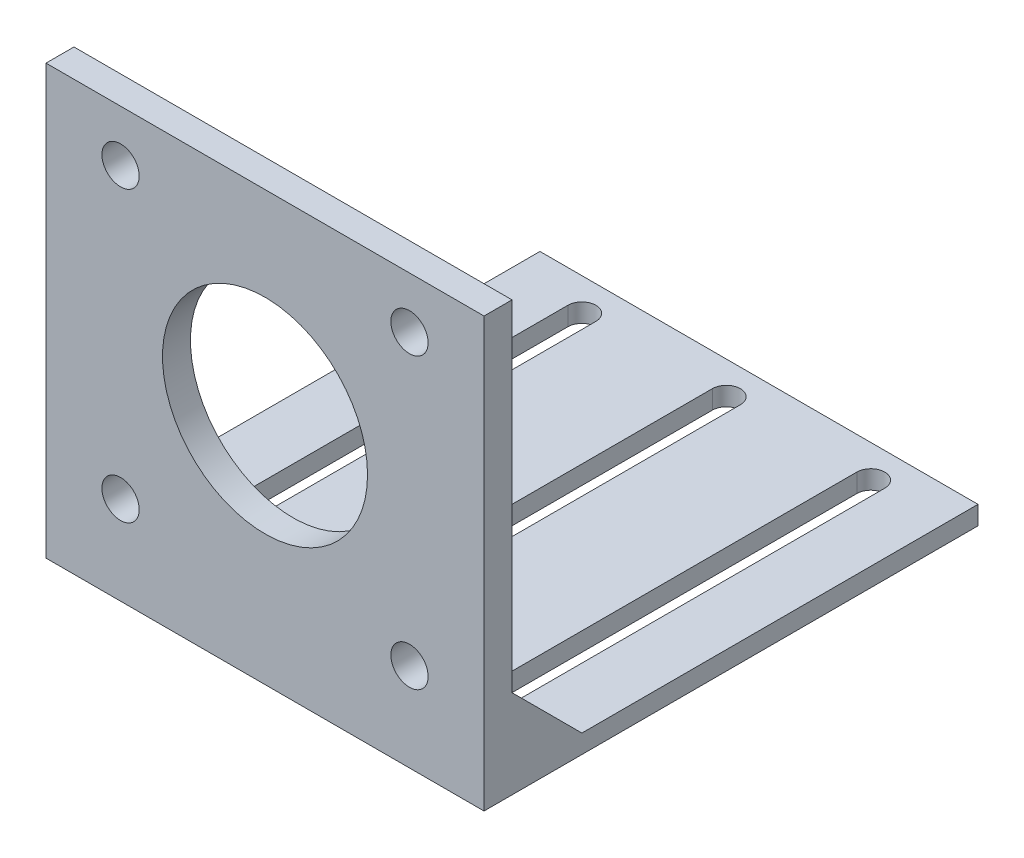
ISO-10303-21;
HEADER;
FILE_DESCRIPTION(('STEP AP214'),'2;1');
FILE_NAME('part.step','',(''),(''),'','','');
FILE_SCHEMA(('AUTOMOTIVE_DESIGN { 1 0 10303 214 1 1 1 1 }'));
ENDSEC;
DATA;
#1=APPLICATION_CONTEXT('core data for automotive mechanical design processes');
#2=APPLICATION_PROTOCOL_DEFINITION('international standard','automotive_design',2000,#1);
#3=PRODUCT_CONTEXT('',#1,'mechanical');
#4=PRODUCT('Part','Part','',(#3));
#5=PRODUCT_RELATED_PRODUCT_CATEGORY('part','',(#4));
#6=PRODUCT_DEFINITION_FORMATION('','',#4);
#7=PRODUCT_DEFINITION_CONTEXT('part definition',#1,'design');
#8=PRODUCT_DEFINITION('design','',#6,#7);
#9=PRODUCT_DEFINITION_SHAPE('','',#8);
#10=(LENGTH_UNIT() NAMED_UNIT(*) SI_UNIT(.MILLI.,.METRE.));
#11=(NAMED_UNIT(*) PLANE_ANGLE_UNIT() SI_UNIT($,.RADIAN.));
#12=(NAMED_UNIT(*) SI_UNIT($,.STERADIAN.) SOLID_ANGLE_UNIT());
#13=UNCERTAINTY_MEASURE_WITH_UNIT(LENGTH_MEASURE(1.E-05),#10,'distance_accuracy_value','');
#14=(GEOMETRIC_REPRESENTATION_CONTEXT(3) GLOBAL_UNCERTAINTY_ASSIGNED_CONTEXT((#13)) GLOBAL_UNIT_ASSIGNED_CONTEXT((#10,
#11,#12)) REPRESENTATION_CONTEXT('',''));
#15=CARTESIAN_POINT('',(0.,0.,0.));
#16=DIRECTION('',(0.,0.,1.));
#17=DIRECTION('',(1.,0.,0.));
#18=AXIS2_PLACEMENT_3D('',#15,#16,#17);
#19=CARTESIAN_POINT('',(0.,0.,-3.));
#20=DIRECTION('',(0.,0.,1.));
#21=DIRECTION('',(1.,0.,0.));
#22=AXIS2_PLACEMENT_3D('',#19,#20,#21);
#23=PLANE('',#22);
#24=CARTESIAN_POINT('',(8.,36.5,-3.));
#25=DIRECTION('',(0.,0.,1.));
#26=DIRECTION('',(1.,0.,0.));
#27=AXIS2_PLACEMENT_3D('',#24,#25,#26);
#28=CIRCLE('',#27,2.);
#29=CARTESIAN_POINT('',(10.,36.5,-3.));
#30=VERTEX_POINT('',#29);
#31=EDGE_CURVE('E348',#30,#30,#28,.F.);
#32=ORIENTED_EDGE('',*,*,#31,.F.);
#33=EDGE_LOOP('',(#32));
#34=FACE_BOUND('',#33,.T.);
#35=CARTESIAN_POINT('',(39.,36.5,-3.));
#36=DIRECTION('',(0.,0.,1.));
#37=DIRECTION('',(1.,0.,0.));
#38=AXIS2_PLACEMENT_3D('',#35,#36,#37);
#39=CIRCLE('',#38,2.00000000000001);
#40=CARTESIAN_POINT('',(41.,36.5,-3.));
#41=VERTEX_POINT('',#40);
#42=EDGE_CURVE('E345',#41,#41,#39,.T.);
#43=ORIENTED_EDGE('',*,*,#42,.T.);
#44=EDGE_LOOP('',(#43));
#45=FACE_BOUND('',#44,.T.);
#46=CARTESIAN_POINT('',(23.5,21.,-3.));
#47=DIRECTION('',(0.,0.,1.));
#48=DIRECTION('',(1.,0.,0.));
#49=AXIS2_PLACEMENT_3D('',#46,#47,#48);
#50=CIRCLE('',#49,11.);
#51=CARTESIAN_POINT('',(34.5,21.,-3.));
#52=VERTEX_POINT('',#51);
#53=EDGE_CURVE('E336',#52,#52,#50,.T.);
#54=ORIENTED_EDGE('',*,*,#53,.T.);
#55=EDGE_LOOP('',(#54));
#56=FACE_BOUND('',#55,.T.);
#57=CARTESIAN_POINT('',(8.,5.49999999999999,-3.));
#58=DIRECTION('',(0.,0.,1.));
#59=DIRECTION('',(1.,0.,0.));
#60=AXIS2_PLACEMENT_3D('',#57,#58,#59);
#61=CIRCLE('',#60,2.);
#62=CARTESIAN_POINT('',(10.,5.49999999999999,-3.));
#63=VERTEX_POINT('',#62);
#64=EDGE_CURVE('E332',#63,#63,#61,.T.);
#65=ORIENTED_EDGE('',*,*,#64,.T.);
#66=EDGE_LOOP('',(#65));
#67=FACE_BOUND('',#66,.T.);
#68=CARTESIAN_POINT('',(39.,5.49999999999999,-3.));
#69=DIRECTION('',(0.,0.,1.));
#70=DIRECTION('',(1.,0.,0.));
#71=AXIS2_PLACEMENT_3D('',#68,#69,#70);
#72=CIRCLE('',#71,2.);
#73=CARTESIAN_POINT('',(41.,5.49999999999999,-3.));
#74=VERTEX_POINT('',#73);
#75=EDGE_CURVE('E329',#74,#74,#72,.F.);
#76=ORIENTED_EDGE('',*,*,#75,.F.);
#77=EDGE_LOOP('',(#76));
#78=FACE_BOUND('',#77,.T.);
#79=DIRECTION('',(0.,-1.,0.));
#80=VECTOR('',#79,1.);
#81=CARTESIAN_POINT('',(47.,0.,-3.));
#82=LINE('',#81,#80);
#83=CARTESIAN_POINT('',(47.,42.,-3.));
#84=VERTEX_POINT('',#83);
#85=CARTESIAN_POINT('',(47.,5.5,-3.));
#86=VERTEX_POINT('',#85);
#87=EDGE_CURVE('E339',#84,#86,#82,.T.);
#88=ORIENTED_EDGE('',*,*,#87,.T.);
#89=DIRECTION('',(1.,0.,0.));
#90=VECTOR('',#89,1.);
#91=CARTESIAN_POINT('',(0.,5.5,-3.));
#92=LINE('',#91,#90);
#93=CARTESIAN_POINT('',(45.,5.5,-3.));
#94=VERTEX_POINT('',#93);
#95=EDGE_CURVE('E291',#86,#94,#92,.F.);
#96=ORIENTED_EDGE('',*,*,#95,.T.);
#97=DIRECTION('',(0.,1.,0.));
#98=VECTOR('',#97,1.);
#99=CARTESIAN_POINT('',(45.,0.,-3.));
#100=LINE('',#99,#98);
#101=CARTESIAN_POINT('',(45.,-2.,-3.));
#102=VERTEX_POINT('',#101);
#103=EDGE_CURVE('E286',#102,#94,#100,.T.);
#104=ORIENTED_EDGE('',*,*,#103,.F.);
#105=DIRECTION('',(1.,0.,0.));
#106=VECTOR('',#105,1.);
#107=CARTESIAN_POINT('',(47.,-2.,-3.));
#108=LINE('',#107,#106);
#109=CARTESIAN_POINT('',(2.,-2.,-3.));
#110=VERTEX_POINT('',#109);
#111=EDGE_CURVE('E303',#110,#102,#108,.T.);
#112=ORIENTED_EDGE('',*,*,#111,.F.);
#113=DIRECTION('',(0.,1.,0.));
#114=VECTOR('',#113,1.);
#115=CARTESIAN_POINT('',(2.,0.,-3.));
#116=LINE('',#115,#114);
#117=CARTESIAN_POINT('',(2.,5.5,-3.));
#118=VERTEX_POINT('',#117);
#119=EDGE_CURVE('E297',#110,#118,#116,.T.);
#120=ORIENTED_EDGE('',*,*,#119,.T.);
#121=DIRECTION('',(1.,0.,0.));
#122=VECTOR('',#121,1.);
#123=CARTESIAN_POINT('',(0.,5.5,-3.));
#124=LINE('',#123,#122);
#125=CARTESIAN_POINT('',(0.,5.5,-3.));
#126=VERTEX_POINT('',#125);
#127=EDGE_CURVE('E301',#118,#126,#124,.F.);
#128=ORIENTED_EDGE('',*,*,#127,.T.);
#129=DIRECTION('',(0.,1.,0.));
#130=VECTOR('',#129,1.);
#131=CARTESIAN_POINT('',(0.,0.,-3.));
#132=LINE('',#131,#130);
#133=CARTESIAN_POINT('',(0.,42.,-3.));
#134=VERTEX_POINT('',#133);
#135=EDGE_CURVE('E343',#126,#134,#132,.T.);
#136=ORIENTED_EDGE('',*,*,#135,.T.);
#137=DIRECTION('',(1.,0.,0.));
#138=VECTOR('',#137,1.);
#139=CARTESIAN_POINT('',(0.,42.,-3.));
#140=LINE('',#139,#138);
#141=EDGE_CURVE('E341',#134,#84,#140,.T.);
#142=ORIENTED_EDGE('',*,*,#141,.T.);
#143=EDGE_LOOP('',(#88,#96,#104,#112,#120,#128,#136,#142));
#144=FACE_BOUND('',#143,.T.);
#145=ADVANCED_FACE('F35',(#34,#45,#56,#67,#78,#144),#23,.F.);
#146=CARTESIAN_POINT('',(0.,0.,-3.));
#147=DIRECTION('',(1.,0.,0.));
#148=DIRECTION('',(0.,0.,-1.));
#149=AXIS2_PLACEMENT_3D('',#146,#147,#148);
#150=PLANE('',#149);
#151=ORIENTED_EDGE('',*,*,#135,.F.);
#152=DIRECTION('',(0.,-0.707106781186548,-0.707106781186547));
#153=VECTOR('',#152,1.);
#154=CARTESIAN_POINT('',(0.,5.5,-3.));
#155=LINE('',#154,#153);
#156=CARTESIAN_POINT('',(0.,-2.,-10.5));
#157=VERTEX_POINT('',#156);
#158=EDGE_CURVE('E293',#126,#157,#155,.T.);
#159=ORIENTED_EDGE('',*,*,#158,.T.);
#160=DIRECTION('',(0.,0.,1.));
#161=VECTOR('',#160,1.);
#162=CARTESIAN_POINT('',(0.,-2.,-53.));
#163=LINE('',#162,#161);
#164=CARTESIAN_POINT('',(0.,-2.,-53.));
#165=VERTEX_POINT('',#164);
#166=EDGE_CURVE('E318',#165,#157,#163,.T.);
#167=ORIENTED_EDGE('',*,*,#166,.F.);
#168=DIRECTION('',(0.,1.,0.));
#169=VECTOR('',#168,1.);
#170=CARTESIAN_POINT('',(0.,-2.,-53.));
#171=LINE('',#170,#169);
#172=CARTESIAN_POINT('',(0.,-4.,-53.));
#173=VERTEX_POINT('',#172);
#174=EDGE_CURVE('E307',#173,#165,#171,.T.);
#175=ORIENTED_EDGE('',*,*,#174,.F.);
#176=DIRECTION('',(0.,0.,1.));
#177=VECTOR('',#176,1.);
#178=CARTESIAN_POINT('',(0.,-4.,-3.));
#179=LINE('',#178,#177);
#180=CARTESIAN_POINT('',(0.,-4.,0.));
#181=VERTEX_POINT('',#180);
#182=EDGE_CURVE('E322',#173,#181,#179,.T.);
#183=ORIENTED_EDGE('',*,*,#182,.T.);
#184=DIRECTION('',(0.,1.,0.));
#185=VECTOR('',#184,1.);
#186=CARTESIAN_POINT('',(0.,0.,0.));
#187=LINE('',#186,#185);
#188=CARTESIAN_POINT('',(0.,42.,0.));
#189=VERTEX_POINT('',#188);
#190=EDGE_CURVE('E364',#181,#189,#187,.T.);
#191=ORIENTED_EDGE('',*,*,#190,.T.);
#192=DIRECTION('',(0.,0.,1.));
#193=VECTOR('',#192,1.);
#194=CARTESIAN_POINT('',(0.,42.,-3.));
#195=LINE('',#194,#193);
#196=EDGE_CURVE('E371',#134,#189,#195,.T.);
#197=ORIENTED_EDGE('',*,*,#196,.F.);
#198=EDGE_LOOP('',(#151,#159,#167,#175,#183,#191,#197));
#199=FACE_BOUND('',#198,.T.);
#200=ADVANCED_FACE('F405',(#199),#150,.F.);
#201=CARTESIAN_POINT('',(0.,42.,-3.));
#202=DIRECTION('',(0.,-1.,0.));
#203=DIRECTION('',(0.,0.,-1.));
#204=AXIS2_PLACEMENT_3D('',#201,#202,#203);
#205=PLANE('',#204);
#206=DIRECTION('',(1.,0.,0.));
#207=VECTOR('',#206,1.);
#208=CARTESIAN_POINT('',(0.,42.,0.));
#209=LINE('',#208,#207);
#210=CARTESIAN_POINT('',(47.,42.,0.));
#211=VERTEX_POINT('',#210);
#212=EDGE_CURVE('E362',#189,#211,#209,.T.);
#213=ORIENTED_EDGE('',*,*,#212,.T.);
#214=DIRECTION('',(0.,0.,1.));
#215=VECTOR('',#214,1.);
#216=CARTESIAN_POINT('',(47.,42.,-3.));
#217=LINE('',#216,#215);
#218=EDGE_CURVE('E351',#84,#211,#217,.T.);
#219=ORIENTED_EDGE('',*,*,#218,.F.);
#220=ORIENTED_EDGE('',*,*,#141,.F.);
#221=ORIENTED_EDGE('',*,*,#196,.T.);
#222=EDGE_LOOP('',(#213,#219,#220,#221));
#223=FACE_BOUND('',#222,.T.);
#224=ADVANCED_FACE('F420',(#223),#205,.F.);
#225=CARTESIAN_POINT('',(39.,36.5,-3.));
#226=DIRECTION('',(0.,0.,1.));
#227=DIRECTION('',(1.,0.,0.));
#228=AXIS2_PLACEMENT_3D('',#225,#226,#227);
#229=CYLINDRICAL_SURFACE('',#228,2.00000000000001);
#230=ORIENTED_EDGE('',*,*,#42,.F.);
#231=EDGE_LOOP('',(#230));
#232=FACE_BOUND('',#231,.T.);
#233=CARTESIAN_POINT('',(39.,36.5,0.));
#234=DIRECTION('',(0.,0.,1.));
#235=DIRECTION('',(1.,0.,0.));
#236=AXIS2_PLACEMENT_3D('',#233,#234,#235);
#237=CIRCLE('',#236,2.00000000000001);
#238=CARTESIAN_POINT('',(41.,36.5,0.));
#239=VERTEX_POINT('',#238);
#240=EDGE_CURVE('E366',#239,#239,#237,.T.);
#241=ORIENTED_EDGE('',*,*,#240,.T.);
#242=EDGE_LOOP('',(#241));
#243=FACE_BOUND('',#242,.T.);
#244=ADVANCED_FACE('F454',(#232,#243),#229,.F.);
#245=CARTESIAN_POINT('',(47.,0.,-3.));
#246=DIRECTION('',(-1.,0.,0.));
#247=DIRECTION('',(0.,0.,1.));
#248=AXIS2_PLACEMENT_3D('',#245,#246,#247);
#249=PLANE('',#248);
#250=DIRECTION('',(0.,0.,1.));
#251=VECTOR('',#250,1.);
#252=CARTESIAN_POINT('',(47.,-2.,-53.));
#253=LINE('',#252,#251);
#254=CARTESIAN_POINT('',(47.,-2.,-53.));
#255=VERTEX_POINT('',#254);
#256=CARTESIAN_POINT('',(47.,-2.,-10.5));
#257=VERTEX_POINT('',#256);
#258=EDGE_CURVE('E314',#255,#257,#253,.T.);
#259=ORIENTED_EDGE('',*,*,#258,.T.);
#260=DIRECTION('',(0.,-0.707106781186547,-0.707106781186548));
#261=VECTOR('',#260,1.);
#262=CARTESIAN_POINT('',(47.,5.5,-3.));
#263=LINE('',#262,#261);
#264=EDGE_CURVE('E283',#86,#257,#263,.T.);
#265=ORIENTED_EDGE('',*,*,#264,.F.);
#266=ORIENTED_EDGE('',*,*,#87,.F.);
#267=ORIENTED_EDGE('',*,*,#218,.T.);
#268=DIRECTION('',(0.,-1.,0.));
#269=VECTOR('',#268,1.);
#270=CARTESIAN_POINT('',(47.,0.,0.));
#271=LINE('',#270,#269);
#272=CARTESIAN_POINT('',(47.,-4.,0.));
#273=VERTEX_POINT('',#272);
#274=EDGE_CURVE('E360',#211,#273,#271,.T.);
#275=ORIENTED_EDGE('',*,*,#274,.T.);
#276=DIRECTION('',(0.,0.,1.));
#277=VECTOR('',#276,1.);
#278=CARTESIAN_POINT('',(47.,-4.,-3.));
#279=LINE('',#278,#277);
#280=CARTESIAN_POINT('',(47.,-4.,-53.));
#281=VERTEX_POINT('',#280);
#282=EDGE_CURVE('E323',#281,#273,#279,.T.);
#283=ORIENTED_EDGE('',*,*,#282,.F.);
#284=DIRECTION('',(0.,-1.,0.));
#285=VECTOR('',#284,1.);
#286=CARTESIAN_POINT('',(47.,-4.,-53.));
#287=LINE('',#286,#285);
#288=EDGE_CURVE('E311',#255,#281,#287,.T.);
#289=ORIENTED_EDGE('',*,*,#288,.F.);
#290=EDGE_LOOP('',(#259,#265,#266,#267,#275,#283,#289));
#291=FACE_BOUND('',#290,.T.);
#292=ADVANCED_FACE('F394',(#291),#249,.F.);
#293=CARTESIAN_POINT('',(23.5,21.,-3.));
#294=DIRECTION('',(0.,0.,1.));
#295=DIRECTION('',(1.,0.,0.));
#296=AXIS2_PLACEMENT_3D('',#293,#294,#295);
#297=CYLINDRICAL_SURFACE('',#296,11.);
#298=ORIENTED_EDGE('',*,*,#53,.F.);
#299=EDGE_LOOP('',(#298));
#300=FACE_BOUND('',#299,.T.);
#301=CARTESIAN_POINT('',(23.5,21.,0.));
#302=DIRECTION('',(0.,0.,1.));
#303=DIRECTION('',(1.,0.,0.));
#304=AXIS2_PLACEMENT_3D('',#301,#302,#303);
#305=CIRCLE('',#304,11.);
#306=CARTESIAN_POINT('',(34.5,21.,0.));
#307=VERTEX_POINT('',#306);
#308=EDGE_CURVE('E357',#307,#307,#305,.T.);
#309=ORIENTED_EDGE('',*,*,#308,.T.);
#310=EDGE_LOOP('',(#309));
#311=FACE_BOUND('',#310,.T.);
#312=ADVANCED_FACE('F462',(#300,#311),#297,.F.);
#313=CARTESIAN_POINT('',(8.,5.49999999999999,-3.));
#314=DIRECTION('',(0.,0.,1.));
#315=DIRECTION('',(1.,0.,0.));
#316=AXIS2_PLACEMENT_3D('',#313,#314,#315);
#317=CYLINDRICAL_SURFACE('',#316,2.);
#318=ORIENTED_EDGE('',*,*,#64,.F.);
#319=EDGE_LOOP('',(#318));
#320=FACE_BOUND('',#319,.T.);
#321=CARTESIAN_POINT('',(8.,5.49999999999999,0.));
#322=DIRECTION('',(0.,0.,1.));
#323=DIRECTION('',(1.,0.,0.));
#324=AXIS2_PLACEMENT_3D('',#321,#322,#323);
#325=CIRCLE('',#324,2.);
#326=CARTESIAN_POINT('',(10.,5.49999999999999,0.));
#327=VERTEX_POINT('',#326);
#328=EDGE_CURVE('E354',#327,#327,#325,.T.);
#329=ORIENTED_EDGE('',*,*,#328,.T.);
#330=EDGE_LOOP('',(#329));
#331=FACE_BOUND('',#330,.T.);
#332=ADVANCED_FACE('F464',(#320,#331),#317,.F.);
#333=CARTESIAN_POINT('',(39.,5.49999999999999,-3.));
#334=DIRECTION('',(0.,0.,1.));
#335=DIRECTION('',(1.,0.,0.));
#336=AXIS2_PLACEMENT_3D('',#333,#334,#335);
#337=CYLINDRICAL_SURFACE('',#336,2.);
#338=ORIENTED_EDGE('',*,*,#75,.T.);
#339=EDGE_LOOP('',(#338));
#340=FACE_BOUND('',#339,.T.);
#341=CARTESIAN_POINT('',(39.,5.49999999999999,0.));
#342=DIRECTION('',(0.,0.,1.));
#343=DIRECTION('',(1.,0.,0.));
#344=AXIS2_PLACEMENT_3D('',#341,#342,#343);
#345=CIRCLE('',#344,2.);
#346=CARTESIAN_POINT('',(41.,5.49999999999999,0.));
#347=VERTEX_POINT('',#346);
#348=EDGE_CURVE('E326',#347,#347,#345,.F.);
#349=ORIENTED_EDGE('',*,*,#348,.F.);
#350=EDGE_LOOP('',(#349));
#351=FACE_BOUND('',#350,.T.);
#352=ADVANCED_FACE('F37',(#340,#351),#337,.F.);
#353=CARTESIAN_POINT('',(8.,36.5,-3.));
#354=DIRECTION('',(0.,0.,1.));
#355=DIRECTION('',(1.,0.,0.));
#356=AXIS2_PLACEMENT_3D('',#353,#354,#355);
#357=CYLINDRICAL_SURFACE('',#356,2.);
#358=ORIENTED_EDGE('',*,*,#31,.T.);
#359=EDGE_LOOP('',(#358));
#360=FACE_BOUND('',#359,.T.);
#361=CARTESIAN_POINT('',(8.,36.5,0.));
#362=DIRECTION('',(0.,0.,1.));
#363=DIRECTION('',(1.,0.,0.));
#364=AXIS2_PLACEMENT_3D('',#361,#362,#363);
#365=CIRCLE('',#364,2.);
#366=CARTESIAN_POINT('',(10.,36.5,0.));
#367=VERTEX_POINT('',#366);
#368=EDGE_CURVE('E333',#367,#367,#365,.F.);
#369=ORIENTED_EDGE('',*,*,#368,.F.);
#370=EDGE_LOOP('',(#369));
#371=FACE_BOUND('',#370,.T.);
#372=ADVANCED_FACE('F438',(#360,#371),#357,.F.);
#373=CARTESIAN_POINT('',(0.,0.,0.));
#374=DIRECTION('',(0.,0.,1.));
#375=DIRECTION('',(1.,0.,0.));
#376=AXIS2_PLACEMENT_3D('',#373,#374,#375);
#377=PLANE('',#376);
#378=DIRECTION('',(-1.,0.,0.));
#379=VECTOR('',#378,1.);
#380=CARTESIAN_POINT('',(0.,-4.,0.));
#381=LINE('',#380,#379);
#382=EDGE_CURVE('E320',#273,#181,#381,.T.);
#383=ORIENTED_EDGE('',*,*,#382,.F.);
#384=ORIENTED_EDGE('',*,*,#274,.F.);
#385=ORIENTED_EDGE('',*,*,#212,.F.);
#386=ORIENTED_EDGE('',*,*,#190,.F.);
#387=EDGE_LOOP('',(#383,#384,#385,#386));
#388=FACE_BOUND('',#387,.T.);
#389=ORIENTED_EDGE('',*,*,#348,.T.);
#390=EDGE_LOOP('',(#389));
#391=FACE_BOUND('',#390,.T.);
#392=ORIENTED_EDGE('',*,*,#328,.F.);
#393=EDGE_LOOP('',(#392));
#394=FACE_BOUND('',#393,.T.);
#395=ORIENTED_EDGE('',*,*,#308,.F.);
#396=EDGE_LOOP('',(#395));
#397=FACE_BOUND('',#396,.T.);
#398=ORIENTED_EDGE('',*,*,#240,.F.);
#399=EDGE_LOOP('',(#398));
#400=FACE_BOUND('',#399,.T.);
#401=ORIENTED_EDGE('',*,*,#368,.T.);
#402=EDGE_LOOP('',(#401));
#403=FACE_BOUND('',#402,.T.);
#404=ADVANCED_FACE('F425',(#388,#391,#394,#397,#400,#403),#377,.T.);
#405=CARTESIAN_POINT('',(0.,-4.,-3.));
#406=DIRECTION('',(0.,1.,0.));
#407=DIRECTION('',(0.,0.,1.));
#408=AXIS2_PLACEMENT_3D('',#405,#406,#407);
#409=PLANE('',#408);
#410=DIRECTION('',(0.,0.,1.));
#411=VECTOR('',#410,1.);
#412=CARTESIAN_POINT('',(9.50000000000001,-4.,-3.));
#413=LINE('',#412,#411);
#414=CARTESIAN_POINT('',(9.5,-4.,-49.5));
#415=VERTEX_POINT('',#414);
#416=CARTESIAN_POINT('',(9.50000000000001,-4.,-10.5));
#417=VERTEX_POINT('',#416);
#418=EDGE_CURVE('E248',#415,#417,#413,.T.);
#419=ORIENTED_EDGE('',*,*,#418,.F.);
#420=CARTESIAN_POINT('',(8.,-4.,-49.5));
#421=DIRECTION('',(0.,1.,0.));
#422=DIRECTION('',(0.,0.,1.));
#423=AXIS2_PLACEMENT_3D('',#420,#421,#422);
#424=CIRCLE('',#423,1.5);
#425=CARTESIAN_POINT('',(6.5,-4.,-49.5));
#426=VERTEX_POINT('',#425);
#427=EDGE_CURVE('E190',#415,#426,#424,.T.);
#428=ORIENTED_EDGE('',*,*,#427,.T.);
#429=DIRECTION('',(0.,0.,1.));
#430=VECTOR('',#429,1.);
#431=CARTESIAN_POINT('',(6.5,-4.,-3.));
#432=LINE('',#431,#430);
#433=CARTESIAN_POINT('',(6.5,-4.,-10.5));
#434=VERTEX_POINT('',#433);
#435=EDGE_CURVE('E242',#426,#434,#432,.T.);
#436=ORIENTED_EDGE('',*,*,#435,.T.);
#437=CARTESIAN_POINT('',(8.00000000000001,-4.,-10.5));
#438=DIRECTION('',(0.,1.,0.));
#439=DIRECTION('',(0.,0.,1.));
#440=AXIS2_PLACEMENT_3D('',#437,#438,#439);
#441=CIRCLE('',#440,1.50000000000001);
#442=EDGE_CURVE('E245',#434,#417,#441,.T.);
#443=ORIENTED_EDGE('',*,*,#442,.T.);
#444=EDGE_LOOP('',(#419,#428,#436,#443));
#445=FACE_BOUND('',#444,.T.);
#446=DIRECTION('',(0.,0.,1.));
#447=VECTOR('',#446,1.);
#448=CARTESIAN_POINT('',(40.5,-4.,-3.00000000000001));
#449=LINE('',#448,#447);
#450=CARTESIAN_POINT('',(40.5,-4.,-49.5));
#451=VERTEX_POINT('',#450);
#452=CARTESIAN_POINT('',(40.5,-4.,-10.5));
#453=VERTEX_POINT('',#452);
#454=EDGE_CURVE('E237',#451,#453,#449,.T.);
#455=ORIENTED_EDGE('',*,*,#454,.F.);
#456=CARTESIAN_POINT('',(39.,-4.,-49.5));
#457=DIRECTION('',(0.,1.,0.));
#458=DIRECTION('',(0.,0.,1.));
#459=AXIS2_PLACEMENT_3D('',#456,#457,#458);
#460=CIRCLE('',#459,1.5);
#461=CARTESIAN_POINT('',(37.5,-4.,-49.5));
#462=VERTEX_POINT('',#461);
#463=EDGE_CURVE('E239',#451,#462,#460,.T.);
#464=ORIENTED_EDGE('',*,*,#463,.T.);
#465=DIRECTION('',(0.,0.,1.));
#466=VECTOR('',#465,1.);
#467=CARTESIAN_POINT('',(37.5,-4.,-3.));
#468=LINE('',#467,#466);
#469=CARTESIAN_POINT('',(37.5,-4.,-10.5));
#470=VERTEX_POINT('',#469);
#471=EDGE_CURVE('E210',#462,#470,#468,.T.);
#472=ORIENTED_EDGE('',*,*,#471,.T.);
#473=CARTESIAN_POINT('',(39.,-4.,-10.5));
#474=DIRECTION('',(0.,1.,0.));
#475=DIRECTION('',(0.,0.,1.));
#476=AXIS2_PLACEMENT_3D('',#473,#474,#475);
#477=CIRCLE('',#476,1.5);
#478=EDGE_CURVE('E213',#470,#453,#477,.T.);
#479=ORIENTED_EDGE('',*,*,#478,.T.);
#480=EDGE_LOOP('',(#455,#464,#472,#479));
#481=FACE_BOUND('',#480,.T.);
#482=DIRECTION('',(0.,0.,-1.));
#483=VECTOR('',#482,1.);
#484=CARTESIAN_POINT('',(22.,-4.,-3.));
#485=LINE('',#484,#483);
#486=CARTESIAN_POINT('',(22.,-4.,-10.5));
#487=VERTEX_POINT('',#486);
#488=CARTESIAN_POINT('',(22.,-4.,-49.5));
#489=VERTEX_POINT('',#488);
#490=EDGE_CURVE('E277',#487,#489,#485,.T.);
#491=ORIENTED_EDGE('',*,*,#490,.F.);
#492=CARTESIAN_POINT('',(23.5,-4.,-10.5));
#493=DIRECTION('',(0.,1.,0.));
#494=DIRECTION('',(0.,0.,1.));
#495=AXIS2_PLACEMENT_3D('',#492,#493,#494);
#496=CIRCLE('',#495,1.5);
#497=CARTESIAN_POINT('',(25.,-4.,-10.5));
#498=VERTEX_POINT('',#497);
#499=EDGE_CURVE('E279',#487,#498,#496,.T.);
#500=ORIENTED_EDGE('',*,*,#499,.T.);
#501=DIRECTION('',(0.,0.,-1.));
#502=VECTOR('',#501,1.);
#503=CARTESIAN_POINT('',(25.,-4.,-3.));
#504=LINE('',#503,#502);
#505=CARTESIAN_POINT('',(25.,-4.,-49.5));
#506=VERTEX_POINT('',#505);
#507=EDGE_CURVE('E265',#498,#506,#504,.T.);
#508=ORIENTED_EDGE('',*,*,#507,.T.);
#509=CARTESIAN_POINT('',(23.5,-4.,-49.5));
#510=DIRECTION('',(0.,1.,0.));
#511=DIRECTION('',(0.,0.,1.));
#512=AXIS2_PLACEMENT_3D('',#509,#510,#511);
#513=CIRCLE('',#512,1.5);
#514=EDGE_CURVE('E274',#506,#489,#513,.T.);
#515=ORIENTED_EDGE('',*,*,#514,.T.);
#516=EDGE_LOOP('',(#491,#500,#508,#515));
#517=FACE_BOUND('',#516,.T.);
#518=ORIENTED_EDGE('',*,*,#282,.T.);
#519=ORIENTED_EDGE('',*,*,#382,.T.);
#520=ORIENTED_EDGE('',*,*,#182,.F.);
#521=DIRECTION('',(-1.,0.,0.));
#522=VECTOR('',#521,1.);
#523=CARTESIAN_POINT('',(0.,-4.,-53.));
#524=LINE('',#523,#522);
#525=EDGE_CURVE('E304',#281,#173,#524,.T.);
#526=ORIENTED_EDGE('',*,*,#525,.F.);
#527=EDGE_LOOP('',(#518,#519,#520,#526));
#528=FACE_BOUND('',#527,.T.);
#529=ADVANCED_FACE('F429',(#445,#481,#517,#528),#409,.F.);
#530=CARTESIAN_POINT('',(47.,-2.,-53.));
#531=DIRECTION('',(0.,-1.,0.));
#532=DIRECTION('',(0.,0.,-1.));
#533=AXIS2_PLACEMENT_3D('',#530,#531,#532);
#534=PLANE('',#533);
#535=DIRECTION('',(0.,0.,1.));
#536=VECTOR('',#535,1.);
#537=CARTESIAN_POINT('',(6.5,-2.,-49.5));
#538=LINE('',#537,#536);
#539=CARTESIAN_POINT('',(6.5,-2.,-49.5));
#540=VERTEX_POINT('',#539);
#541=CARTESIAN_POINT('',(6.5,-2.,-10.5));
#542=VERTEX_POINT('',#541);
#543=EDGE_CURVE('E209',#540,#542,#538,.T.);
#544=ORIENTED_EDGE('',*,*,#543,.F.);
#545=CARTESIAN_POINT('',(8.,-2.,-49.5));
#546=DIRECTION('',(0.,1.,0.));
#547=DIRECTION('',(0.,0.,1.));
#548=AXIS2_PLACEMENT_3D('',#545,#546,#547);
#549=CIRCLE('',#548,1.5);
#550=CARTESIAN_POINT('',(9.5,-2.,-49.5));
#551=VERTEX_POINT('',#550);
#552=EDGE_CURVE('E187',#551,#540,#549,.T.);
#553=ORIENTED_EDGE('',*,*,#552,.F.);
#554=DIRECTION('',(0.,0.,1.));
#555=VECTOR('',#554,1.);
#556=CARTESIAN_POINT('',(9.5,-2.,-49.5));
#557=LINE('',#556,#555);
#558=CARTESIAN_POINT('',(9.50000000000001,-2.,-10.5));
#559=VERTEX_POINT('',#558);
#560=EDGE_CURVE('E197',#551,#559,#557,.T.);
#561=ORIENTED_EDGE('',*,*,#560,.T.);
#562=CARTESIAN_POINT('',(8.00000000000001,-2.,-10.5));
#563=DIRECTION('',(0.,1.,0.));
#564=DIRECTION('',(0.,0.,1.));
#565=AXIS2_PLACEMENT_3D('',#562,#563,#564);
#566=CIRCLE('',#565,1.50000000000001);
#567=EDGE_CURVE('E203',#542,#559,#566,.T.);
#568=ORIENTED_EDGE('',*,*,#567,.F.);
#569=EDGE_LOOP('',(#544,#553,#561,#568));
#570=FACE_BOUND('',#569,.T.);
#571=DIRECTION('',(0.,0.,1.));
#572=VECTOR('',#571,1.);
#573=CARTESIAN_POINT('',(37.5,-2.,-49.5));
#574=LINE('',#573,#572);
#575=CARTESIAN_POINT('',(37.5,-2.,-49.5));
#576=VERTEX_POINT('',#575);
#577=CARTESIAN_POINT('',(37.5,-2.,-10.5));
#578=VERTEX_POINT('',#577);
#579=EDGE_CURVE('E232',#576,#578,#574,.T.);
#580=ORIENTED_EDGE('',*,*,#579,.F.);
#581=CARTESIAN_POINT('',(39.,-2.,-49.5));
#582=DIRECTION('',(0.,1.,0.));
#583=DIRECTION('',(0.,0.,1.));
#584=AXIS2_PLACEMENT_3D('',#581,#582,#583);
#585=CIRCLE('',#584,1.5);
#586=CARTESIAN_POINT('',(40.5,-2.,-49.5));
#587=VERTEX_POINT('',#586);
#588=EDGE_CURVE('E194',#587,#576,#585,.T.);
#589=ORIENTED_EDGE('',*,*,#588,.F.);
#590=DIRECTION('',(0.,0.,1.));
#591=VECTOR('',#590,1.);
#592=CARTESIAN_POINT('',(40.5,-2.,-49.5));
#593=LINE('',#592,#591);
#594=CARTESIAN_POINT('',(40.5,-2.,-10.5));
#595=VERTEX_POINT('',#594);
#596=EDGE_CURVE('E221',#587,#595,#593,.T.);
#597=ORIENTED_EDGE('',*,*,#596,.T.);
#598=CARTESIAN_POINT('',(39.,-2.,-10.5));
#599=DIRECTION('',(0.,1.,0.));
#600=DIRECTION('',(0.,0.,1.));
#601=AXIS2_PLACEMENT_3D('',#598,#599,#600);
#602=CIRCLE('',#601,1.5);
#603=EDGE_CURVE('E229',#578,#595,#602,.T.);
#604=ORIENTED_EDGE('',*,*,#603,.F.);
#605=EDGE_LOOP('',(#580,#589,#597,#604));
#606=FACE_BOUND('',#605,.T.);
#607=DIRECTION('',(0.,0.,-1.));
#608=VECTOR('',#607,1.);
#609=CARTESIAN_POINT('',(25.,-2.,-10.5));
#610=LINE('',#609,#608);
#611=CARTESIAN_POINT('',(25.,-2.,-10.5));
#612=VERTEX_POINT('',#611);
#613=CARTESIAN_POINT('',(25.,-2.,-49.5));
#614=VERTEX_POINT('',#613);
#615=EDGE_CURVE('E253',#612,#614,#610,.T.);
#616=ORIENTED_EDGE('',*,*,#615,.F.);
#617=CARTESIAN_POINT('',(23.5,-2.,-10.5));
#618=DIRECTION('',(0.,1.,0.));
#619=DIRECTION('',(0.,0.,1.));
#620=AXIS2_PLACEMENT_3D('',#617,#618,#619);
#621=CIRCLE('',#620,1.5);
#622=CARTESIAN_POINT('',(22.,-2.,-10.5));
#623=VERTEX_POINT('',#622);
#624=EDGE_CURVE('E251',#623,#612,#621,.T.);
#625=ORIENTED_EDGE('',*,*,#624,.F.);
#626=DIRECTION('',(0.,0.,-1.));
#627=VECTOR('',#626,1.);
#628=CARTESIAN_POINT('',(22.,-2.,-10.5));
#629=LINE('',#628,#627);
#630=CARTESIAN_POINT('',(22.,-2.,-49.5));
#631=VERTEX_POINT('',#630);
#632=EDGE_CURVE('E259',#623,#631,#629,.T.);
#633=ORIENTED_EDGE('',*,*,#632,.T.);
#634=CARTESIAN_POINT('',(23.5,-2.,-49.5));
#635=DIRECTION('',(0.,1.,0.));
#636=DIRECTION('',(0.,0.,1.));
#637=AXIS2_PLACEMENT_3D('',#634,#635,#636);
#638=CIRCLE('',#637,1.5);
#639=EDGE_CURVE('E256',#614,#631,#638,.T.);
#640=ORIENTED_EDGE('',*,*,#639,.F.);
#641=EDGE_LOOP('',(#616,#625,#633,#640));
#642=FACE_BOUND('',#641,.T.);
#643=DIRECTION('',(0.,0.,1.));
#644=VECTOR('',#643,1.);
#645=CARTESIAN_POINT('',(45.,-2.,-53.));
#646=LINE('',#645,#644);
#647=CARTESIAN_POINT('',(45.,-2.,-10.5));
#648=VERTEX_POINT('',#647);
#649=EDGE_CURVE('E43',#648,#102,#646,.T.);
#650=ORIENTED_EDGE('',*,*,#649,.F.);
#651=DIRECTION('',(-1.,0.,0.));
#652=VECTOR('',#651,1.);
#653=CARTESIAN_POINT('',(47.,-2.,-10.5));
#654=LINE('',#653,#652);
#655=EDGE_CURVE('E11',#648,#257,#654,.F.);
#656=ORIENTED_EDGE('',*,*,#655,.T.);
#657=ORIENTED_EDGE('',*,*,#258,.F.);
#658=DIRECTION('',(1.,0.,0.));
#659=VECTOR('',#658,1.);
#660=CARTESIAN_POINT('',(47.,-2.,-53.));
#661=LINE('',#660,#659);
#662=EDGE_CURVE('E309',#165,#255,#661,.T.);
#663=ORIENTED_EDGE('',*,*,#662,.F.);
#664=ORIENTED_EDGE('',*,*,#166,.T.);
#665=DIRECTION('',(-1.,0.,0.));
#666=VECTOR('',#665,1.);
#667=CARTESIAN_POINT('',(47.,-2.,-10.5));
#668=LINE('',#667,#666);
#669=CARTESIAN_POINT('',(2.,-2.,-10.5));
#670=VERTEX_POINT('',#669);
#671=EDGE_CURVE('E378',#157,#670,#668,.F.);
#672=ORIENTED_EDGE('',*,*,#671,.T.);
#673=DIRECTION('',(0.,0.,1.));
#674=VECTOR('',#673,1.);
#675=CARTESIAN_POINT('',(2.,-2.,-53.));
#676=LINE('',#675,#674);
#677=EDGE_CURVE('E374',#670,#110,#676,.T.);
#678=ORIENTED_EDGE('',*,*,#677,.T.);
#679=ORIENTED_EDGE('',*,*,#111,.T.);
#680=EDGE_LOOP('',(#650,#656,#657,#663,#664,#672,#678,#679));
#681=FACE_BOUND('',#680,.T.);
#682=ADVANCED_FACE('F207',(#570,#606,#642,#681),#534,.F.);
#683=CARTESIAN_POINT('',(0.,0.,-53.));
#684=DIRECTION('',(0.,0.,1.));
#685=DIRECTION('',(1.,0.,0.));
#686=AXIS2_PLACEMENT_3D('',#683,#684,#685);
#687=PLANE('',#686);
#688=ORIENTED_EDGE('',*,*,#525,.T.);
#689=ORIENTED_EDGE('',*,*,#174,.T.);
#690=ORIENTED_EDGE('',*,*,#662,.T.);
#691=ORIENTED_EDGE('',*,*,#288,.T.);
#692=EDGE_LOOP('',(#688,#689,#690,#691));
#693=FACE_BOUND('',#692,.T.);
#694=ADVANCED_FACE('F400',(#693),#687,.F.);
#695=CARTESIAN_POINT('',(0.,5.5,-3.));
#696=DIRECTION('',(0.,-0.707106781186547,0.707106781186548));
#697=DIRECTION('',(0.,-0.707106781186548,-0.707106781186547));
#698=AXIS2_PLACEMENT_3D('',#695,#696,#697);
#699=PLANE('',#698);
#700=ORIENTED_EDGE('',*,*,#127,.F.);
#701=DIRECTION('',(0.,-0.707106781186548,-0.707106781186547));
#702=VECTOR('',#701,1.);
#703=CARTESIAN_POINT('',(2.,5.5,-3.));
#704=LINE('',#703,#702);
#705=EDGE_CURVE('E294',#118,#670,#704,.T.);
#706=ORIENTED_EDGE('',*,*,#705,.T.);
#707=ORIENTED_EDGE('',*,*,#671,.F.);
#708=ORIENTED_EDGE('',*,*,#158,.F.);
#709=EDGE_LOOP('',(#700,#706,#707,#708));
#710=FACE_BOUND('',#709,.T.);
#711=ADVANCED_FACE('F410',(#710),#699,.F.);
#712=CARTESIAN_POINT('',(2.,19.,-26.5));
#713=DIRECTION('',(1.,0.,0.));
#714=DIRECTION('',(0.,0.,-1.));
#715=AXIS2_PLACEMENT_3D('',#712,#713,#714);
#716=PLANE('',#715);
#717=ORIENTED_EDGE('',*,*,#119,.F.);
#718=ORIENTED_EDGE('',*,*,#677,.F.);
#719=ORIENTED_EDGE('',*,*,#705,.F.);
#720=EDGE_LOOP('',(#717,#718,#719));
#721=FACE_BOUND('',#720,.T.);
#722=ADVANCED_FACE('F415',(#721),#716,.T.);
#723=CARTESIAN_POINT('',(47.,5.5,-3.));
#724=DIRECTION('',(0.,-0.707106781186548,0.707106781186547));
#725=DIRECTION('',(0.,-0.707106781186547,-0.707106781186548));
#726=AXIS2_PLACEMENT_3D('',#723,#724,#725);
#727=PLANE('',#726);
#728=ORIENTED_EDGE('',*,*,#95,.F.);
#729=ORIENTED_EDGE('',*,*,#264,.T.);
#730=ORIENTED_EDGE('',*,*,#655,.F.);
#731=DIRECTION('',(0.,-0.707106781186547,-0.707106781186548));
#732=VECTOR('',#731,1.);
#733=CARTESIAN_POINT('',(45.,5.5,-3.));
#734=LINE('',#733,#732);
#735=EDGE_CURVE('E282',#94,#648,#734,.T.);
#736=ORIENTED_EDGE('',*,*,#735,.F.);
#737=EDGE_LOOP('',(#728,#729,#730,#736));
#738=FACE_BOUND('',#737,.T.);
#739=ADVANCED_FACE('F390',(#738),#727,.F.);
#740=CARTESIAN_POINT('',(45.,19.,-26.5));
#741=DIRECTION('',(1.,0.,0.));
#742=DIRECTION('',(0.,0.,-1.));
#743=AXIS2_PLACEMENT_3D('',#740,#741,#742);
#744=PLANE('',#743);
#745=ORIENTED_EDGE('',*,*,#649,.T.);
#746=ORIENTED_EDGE('',*,*,#103,.T.);
#747=ORIENTED_EDGE('',*,*,#735,.T.);
#748=EDGE_LOOP('',(#745,#746,#747));
#749=FACE_BOUND('',#748,.T.);
#750=ADVANCED_FACE('F381',(#749),#744,.F.);
#751=CARTESIAN_POINT('',(23.5,-52.,-10.5));
#752=DIRECTION('',(0.,1.,0.));
#753=DIRECTION('',(0.,0.,1.));
#754=AXIS2_PLACEMENT_3D('',#751,#752,#753);
#755=CYLINDRICAL_SURFACE('',#754,1.5);
#756=DIRECTION('',(0.,1.,0.));
#757=VECTOR('',#756,1.);
#758=CARTESIAN_POINT('',(22.,-52.,-10.5));
#759=LINE('',#758,#757);
#760=EDGE_CURVE('E263',#487,#623,#759,.T.);
#761=ORIENTED_EDGE('',*,*,#760,.T.);
#762=ORIENTED_EDGE('',*,*,#624,.T.);
#763=DIRECTION('',(0.,1.,0.));
#764=VECTOR('',#763,1.);
#765=CARTESIAN_POINT('',(25.,-52.,-10.5));
#766=LINE('',#765,#764);
#767=EDGE_CURVE('E262',#498,#612,#766,.T.);
#768=ORIENTED_EDGE('',*,*,#767,.F.);
#769=ORIENTED_EDGE('',*,*,#499,.F.);
#770=EDGE_LOOP('',(#761,#762,#768,#769));
#771=FACE_BOUND('',#770,.T.);
#772=ADVANCED_FACE('F524',(#771),#755,.F.);
#773=CARTESIAN_POINT('',(22.,-52.,-10.5));
#774=DIRECTION('',(1.,0.,0.));
#775=DIRECTION('',(0.,0.,-1.));
#776=AXIS2_PLACEMENT_3D('',#773,#774,#775);
#777=PLANE('',#776);
#778=ORIENTED_EDGE('',*,*,#490,.T.);
#779=DIRECTION('',(0.,1.,0.));
#780=VECTOR('',#779,1.);
#781=CARTESIAN_POINT('',(22.,-52.,-49.5));
#782=LINE('',#781,#780);
#783=EDGE_CURVE('E266',#489,#631,#782,.T.);
#784=ORIENTED_EDGE('',*,*,#783,.T.);
#785=ORIENTED_EDGE('',*,*,#632,.F.);
#786=ORIENTED_EDGE('',*,*,#760,.F.);
#787=EDGE_LOOP('',(#778,#784,#785,#786));
#788=FACE_BOUND('',#787,.T.);
#789=ADVANCED_FACE('F547',(#788),#777,.T.);
#790=CARTESIAN_POINT('',(23.5,-52.,-49.5));
#791=DIRECTION('',(0.,1.,0.));
#792=DIRECTION('',(0.,0.,1.));
#793=AXIS2_PLACEMENT_3D('',#790,#791,#792);
#794=CYLINDRICAL_SURFACE('',#793,1.5);
#795=DIRECTION('',(0.,1.,0.));
#796=VECTOR('',#795,1.);
#797=CARTESIAN_POINT('',(25.,-52.,-49.5));
#798=LINE('',#797,#796);
#799=EDGE_CURVE('E268',#506,#614,#798,.T.);
#800=ORIENTED_EDGE('',*,*,#799,.T.);
#801=ORIENTED_EDGE('',*,*,#639,.T.);
#802=ORIENTED_EDGE('',*,*,#783,.F.);
#803=ORIENTED_EDGE('',*,*,#514,.F.);
#804=EDGE_LOOP('',(#800,#801,#802,#803));
#805=FACE_BOUND('',#804,.T.);
#806=ADVANCED_FACE('F557',(#805),#794,.F.);
#807=CARTESIAN_POINT('',(25.,-52.,-10.5));
#808=DIRECTION('',(1.,0.,0.));
#809=DIRECTION('',(0.,0.,-1.));
#810=AXIS2_PLACEMENT_3D('',#807,#808,#809);
#811=PLANE('',#810);
#812=ORIENTED_EDGE('',*,*,#767,.T.);
#813=ORIENTED_EDGE('',*,*,#615,.T.);
#814=ORIENTED_EDGE('',*,*,#799,.F.);
#815=ORIENTED_EDGE('',*,*,#507,.F.);
#816=EDGE_LOOP('',(#812,#813,#814,#815));
#817=FACE_BOUND('',#816,.T.);
#818=ADVANCED_FACE('F567',(#817),#811,.F.);
#819=CARTESIAN_POINT('',(39.,-52.,-49.5));
#820=DIRECTION('',(0.,1.,0.));
#821=DIRECTION('',(0.,0.,1.));
#822=AXIS2_PLACEMENT_3D('',#819,#820,#821);
#823=CYLINDRICAL_SURFACE('',#822,1.5);
#824=DIRECTION('',(0.,1.,0.));
#825=VECTOR('',#824,1.);
#826=CARTESIAN_POINT('',(40.5,-52.,-49.5));
#827=LINE('',#826,#825);
#828=EDGE_CURVE('E225',#451,#587,#827,.T.);
#829=ORIENTED_EDGE('',*,*,#828,.T.);
#830=ORIENTED_EDGE('',*,*,#588,.T.);
#831=DIRECTION('',(0.,1.,0.));
#832=VECTOR('',#831,1.);
#833=CARTESIAN_POINT('',(37.5,-52.,-49.5));
#834=LINE('',#833,#832);
#835=EDGE_CURVE('E218',#462,#576,#834,.T.);
#836=ORIENTED_EDGE('',*,*,#835,.F.);
#837=ORIENTED_EDGE('',*,*,#463,.F.);
#838=EDGE_LOOP('',(#829,#830,#836,#837));
#839=FACE_BOUND('',#838,.T.);
#840=ADVANCED_FACE('F577',(#839),#823,.F.);
#841=CARTESIAN_POINT('',(40.5,-52.,-49.5));
#842=DIRECTION('',(-1.,0.,0.));
#843=DIRECTION('',(0.,0.,1.));
#844=AXIS2_PLACEMENT_3D('',#841,#842,#843);
#845=PLANE('',#844);
#846=ORIENTED_EDGE('',*,*,#454,.T.);
#847=DIRECTION('',(0.,1.,0.));
#848=VECTOR('',#847,1.);
#849=CARTESIAN_POINT('',(40.5,-52.,-10.5));
#850=LINE('',#849,#848);
#851=EDGE_CURVE('E223',#453,#595,#850,.T.);
#852=ORIENTED_EDGE('',*,*,#851,.T.);
#853=ORIENTED_EDGE('',*,*,#596,.F.);
#854=ORIENTED_EDGE('',*,*,#828,.F.);
#855=EDGE_LOOP('',(#846,#852,#853,#854));
#856=FACE_BOUND('',#855,.T.);
#857=ADVANCED_FACE('F587',(#856),#845,.T.);
#858=CARTESIAN_POINT('',(39.,-52.,-10.5));
#859=DIRECTION('',(0.,1.,0.));
#860=DIRECTION('',(0.,0.,1.));
#861=AXIS2_PLACEMENT_3D('',#858,#859,#860);
#862=CYLINDRICAL_SURFACE('',#861,1.5);
#863=DIRECTION('',(0.,1.,0.));
#864=VECTOR('',#863,1.);
#865=CARTESIAN_POINT('',(37.5,-52.,-10.5));
#866=LINE('',#865,#864);
#867=EDGE_CURVE('E58',#470,#578,#866,.T.);
#868=ORIENTED_EDGE('',*,*,#867,.T.);
#869=ORIENTED_EDGE('',*,*,#603,.T.);
#870=ORIENTED_EDGE('',*,*,#851,.F.);
#871=ORIENTED_EDGE('',*,*,#478,.F.);
#872=EDGE_LOOP('',(#868,#869,#870,#871));
#873=FACE_BOUND('',#872,.T.);
#874=ADVANCED_FACE('F597',(#873),#862,.F.);
#875=CARTESIAN_POINT('',(37.5,-52.,-49.5));
#876=DIRECTION('',(-1.,0.,0.));
#877=DIRECTION('',(0.,0.,1.));
#878=AXIS2_PLACEMENT_3D('',#875,#876,#877);
#879=PLANE('',#878);
#880=ORIENTED_EDGE('',*,*,#835,.T.);
#881=ORIENTED_EDGE('',*,*,#579,.T.);
#882=ORIENTED_EDGE('',*,*,#867,.F.);
#883=ORIENTED_EDGE('',*,*,#471,.F.);
#884=EDGE_LOOP('',(#880,#881,#882,#883));
#885=FACE_BOUND('',#884,.T.);
#886=ADVANCED_FACE('F607',(#885),#879,.F.);
#887=CARTESIAN_POINT('',(8.,-52.,-49.5));
#888=DIRECTION('',(0.,1.,0.));
#889=DIRECTION('',(0.,0.,1.));
#890=AXIS2_PLACEMENT_3D('',#887,#888,#889);
#891=CYLINDRICAL_SURFACE('',#890,1.5);
#892=DIRECTION('',(0.,1.,0.));
#893=VECTOR('',#892,1.);
#894=CARTESIAN_POINT('',(9.5,-52.,-49.5));
#895=LINE('',#894,#893);
#896=EDGE_CURVE('E182',#415,#551,#895,.T.);
#897=ORIENTED_EDGE('',*,*,#896,.T.);
#898=ORIENTED_EDGE('',*,*,#552,.T.);
#899=DIRECTION('',(0.,1.,0.));
#900=VECTOR('',#899,1.);
#901=CARTESIAN_POINT('',(6.5,-52.,-49.5));
#902=LINE('',#901,#900);
#903=EDGE_CURVE('E204',#426,#540,#902,.T.);
#904=ORIENTED_EDGE('',*,*,#903,.F.);
#905=ORIENTED_EDGE('',*,*,#427,.F.);
#906=EDGE_LOOP('',(#897,#898,#904,#905));
#907=FACE_BOUND('',#906,.T.);
#908=ADVANCED_FACE('F184',(#907),#891,.F.);
#909=CARTESIAN_POINT('',(9.5,-52.,-49.5));
#910=DIRECTION('',(-1.,0.,0.));
#911=DIRECTION('',(0.,0.,1.));
#912=AXIS2_PLACEMENT_3D('',#909,#910,#911);
#913=PLANE('',#912);
#914=ORIENTED_EDGE('',*,*,#418,.T.);
#915=DIRECTION('',(0.,1.,0.));
#916=VECTOR('',#915,1.);
#917=CARTESIAN_POINT('',(9.50000000000001,-52.,-10.5));
#918=LINE('',#917,#916);
#919=EDGE_CURVE('E193',#417,#559,#918,.T.);
#920=ORIENTED_EDGE('',*,*,#919,.T.);
#921=ORIENTED_EDGE('',*,*,#560,.F.);
#922=ORIENTED_EDGE('',*,*,#896,.F.);
#923=EDGE_LOOP('',(#914,#920,#921,#922));
#924=FACE_BOUND('',#923,.T.);
#925=ADVANCED_FACE('F198',(#924),#913,.T.);
#926=CARTESIAN_POINT('',(8.00000000000001,-52.,-10.5));
#927=DIRECTION('',(0.,1.,0.));
#928=DIRECTION('',(0.,0.,1.));
#929=AXIS2_PLACEMENT_3D('',#926,#927,#928);
#930=CYLINDRICAL_SURFACE('',#929,1.50000000000001);
#931=DIRECTION('',(0.,1.,0.));
#932=VECTOR('',#931,1.);
#933=CARTESIAN_POINT('',(6.5,-52.,-10.5));
#934=LINE('',#933,#932);
#935=EDGE_CURVE('E50',#434,#542,#934,.T.);
#936=ORIENTED_EDGE('',*,*,#935,.T.);
#937=ORIENTED_EDGE('',*,*,#567,.T.);
#938=ORIENTED_EDGE('',*,*,#919,.F.);
#939=ORIENTED_EDGE('',*,*,#442,.F.);
#940=EDGE_LOOP('',(#936,#937,#938,#939));
#941=FACE_BOUND('',#940,.T.);
#942=ADVANCED_FACE('F633',(#941),#930,.F.);
#943=CARTESIAN_POINT('',(6.5,-52.,-49.5));
#944=DIRECTION('',(-1.,0.,0.));
#945=DIRECTION('',(0.,0.,1.));
#946=AXIS2_PLACEMENT_3D('',#943,#944,#945);
#947=PLANE('',#946);
#948=ORIENTED_EDGE('',*,*,#903,.T.);
#949=ORIENTED_EDGE('',*,*,#543,.T.);
#950=ORIENTED_EDGE('',*,*,#935,.F.);
#951=ORIENTED_EDGE('',*,*,#435,.F.);
#952=EDGE_LOOP('',(#948,#949,#950,#951));
#953=FACE_BOUND('',#952,.T.);
#954=ADVANCED_FACE('F642',(#953),#947,.F.);
#955=CLOSED_SHELL('',(#145,#200,#224,#244,#292,#312,#332,#352,#372,#404,#529,#682,#694,#711,
#722,#739,#750,#772,#789,#806,#818,#840,#857,#874,#886,#908,#925,#942,#954));
#956=MANIFOLD_SOLID_BREP('B2',#955);
#957=ADVANCED_BREP_SHAPE_REPRESENTATION('',(#18,#956),#14);
#958=SHAPE_DEFINITION_REPRESENTATION(#9,#957);
ENDSEC;
END-ISO-10303-21;
